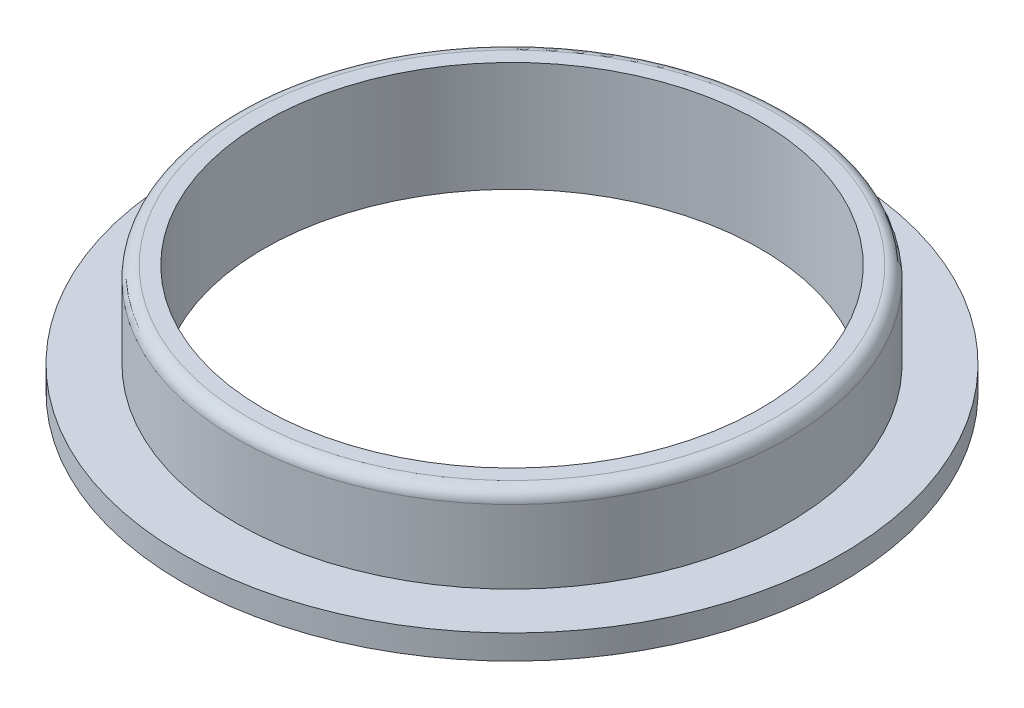
ISO-10303-21;
HEADER;
FILE_DESCRIPTION(('STEP AP214'),'2;1');
FILE_NAME('part.step','',(''),(''),'','','');
FILE_SCHEMA(('AUTOMOTIVE_DESIGN { 1 0 10303 214 1 1 1 1 }'));
ENDSEC;
DATA;
#1=APPLICATION_CONTEXT('core data for automotive mechanical design processes');
#2=APPLICATION_PROTOCOL_DEFINITION('international standard','automotive_design',2000,#1);
#3=PRODUCT_CONTEXT('',#1,'mechanical');
#4=PRODUCT('Part','Part','',(#3));
#5=PRODUCT_RELATED_PRODUCT_CATEGORY('part','',(#4));
#6=PRODUCT_DEFINITION_FORMATION('','',#4);
#7=PRODUCT_DEFINITION_CONTEXT('part definition',#1,'design');
#8=PRODUCT_DEFINITION('design','',#6,#7);
#9=PRODUCT_DEFINITION_SHAPE('','',#8);
#10=(LENGTH_UNIT() NAMED_UNIT(*) SI_UNIT(.MILLI.,.METRE.));
#11=(NAMED_UNIT(*) PLANE_ANGLE_UNIT() SI_UNIT($,.RADIAN.));
#12=(NAMED_UNIT(*) SI_UNIT($,.STERADIAN.) SOLID_ANGLE_UNIT());
#13=UNCERTAINTY_MEASURE_WITH_UNIT(LENGTH_MEASURE(1.E-05),#10,'distance_accuracy_value','');
#14=(GEOMETRIC_REPRESENTATION_CONTEXT(3) GLOBAL_UNCERTAINTY_ASSIGNED_CONTEXT((#13)) GLOBAL_UNIT_ASSIGNED_CONTEXT((#10,
#11,#12)) REPRESENTATION_CONTEXT('',''));
#15=CARTESIAN_POINT('',(0.,0.,0.));
#16=DIRECTION('',(0.,0.,1.));
#17=DIRECTION('',(1.,0.,0.));
#18=AXIS2_PLACEMENT_3D('',#15,#16,#17);
#19=CARTESIAN_POINT('',(0.,9.,0.));
#20=DIRECTION('',(0.,-1.,0.));
#21=DIRECTION('',(0.,0.,-1.));
#22=AXIS2_PLACEMENT_3D('',#19,#20,#21);
#23=CYLINDRICAL_SURFACE('',#22,27.);
#24=CARTESIAN_POINT('',(0.,0.,0.));
#25=DIRECTION('',(0.,1.,0.));
#26=DIRECTION('',(0.,0.,1.));
#27=AXIS2_PLACEMENT_3D('',#24,#25,#26);
#28=CIRCLE('',#27,27.);
#29=CARTESIAN_POINT('',(0.,0.,27.));
#30=VERTEX_POINT('',#29);
#31=EDGE_CURVE('E28',#30,#30,#28,.T.);
#32=ORIENTED_EDGE('',*,*,#31,.T.);
#33=EDGE_LOOP('',(#32));
#34=FACE_BOUND('',#33,.T.);
#35=CARTESIAN_POINT('',(0.,2.,0.));
#36=DIRECTION('',(0.,1.,0.));
#37=DIRECTION('',(0.,0.,1.));
#38=AXIS2_PLACEMENT_3D('',#35,#36,#37);
#39=CIRCLE('',#38,27.);
#40=CARTESIAN_POINT('',(0.,2.,27.));
#41=VERTEX_POINT('',#40);
#42=EDGE_CURVE('E33',#41,#41,#39,.T.);
#43=ORIENTED_EDGE('',*,*,#42,.F.);
#44=EDGE_LOOP('',(#43));
#45=FACE_BOUND('',#44,.T.);
#46=ADVANCED_FACE('F14',(#34,#45),#23,.T.);
#47=CARTESIAN_POINT('',(0.,0.,0.));
#48=DIRECTION('',(0.,1.,0.));
#49=DIRECTION('',(0.,0.,1.));
#50=AXIS2_PLACEMENT_3D('',#47,#48,#49);
#51=PLANE('',#50);
#52=CARTESIAN_POINT('',(0.,0.,0.));
#53=DIRECTION('',(0.,1.,0.));
#54=DIRECTION('',(0.,0.,1.));
#55=AXIS2_PLACEMENT_3D('',#52,#53,#54);
#56=CIRCLE('',#55,20.35);
#57=CARTESIAN_POINT('',(0.,0.,20.35));
#58=VERTEX_POINT('',#57);
#59=EDGE_CURVE('E43',#58,#58,#56,.T.);
#60=ORIENTED_EDGE('',*,*,#59,.T.);
#61=EDGE_LOOP('',(#60));
#62=FACE_BOUND('',#61,.T.);
#63=ORIENTED_EDGE('',*,*,#31,.F.);
#64=EDGE_LOOP('',(#63));
#65=FACE_BOUND('',#64,.T.);
#66=ADVANCED_FACE('F52',(#62,#65),#51,.F.);
#67=CARTESIAN_POINT('',(0.,2.,0.));
#68=DIRECTION('',(0.,1.,0.));
#69=DIRECTION('',(0.,0.,1.));
#70=AXIS2_PLACEMENT_3D('',#67,#68,#69);
#71=PLANE('',#70);
#72=CARTESIAN_POINT('',(0.,2.,0.));
#73=DIRECTION('',(0.,1.,0.));
#74=DIRECTION('',(0.,0.,1.));
#75=AXIS2_PLACEMENT_3D('',#72,#73,#74);
#76=CIRCLE('',#75,22.6);
#77=CARTESIAN_POINT('',(0.,2.,22.6));
#78=VERTEX_POINT('',#77);
#79=EDGE_CURVE('E38',#78,#78,#76,.T.);
#80=ORIENTED_EDGE('',*,*,#79,.F.);
#81=EDGE_LOOP('',(#80));
#82=FACE_BOUND('',#81,.T.);
#83=ORIENTED_EDGE('',*,*,#42,.T.);
#84=EDGE_LOOP('',(#83));
#85=FACE_BOUND('',#84,.T.);
#86=ADVANCED_FACE('F70',(#82,#85),#71,.T.);
#87=CARTESIAN_POINT('',(0.,2.,0.));
#88=DIRECTION('',(0.,1.,0.));
#89=DIRECTION('',(0.,0.,1.));
#90=AXIS2_PLACEMENT_3D('',#87,#88,#89);
#91=CYLINDRICAL_SURFACE('',#90,22.6);
#92=CARTESIAN_POINT('',(0.,8.,0.));
#93=DIRECTION('',(0.,1.,0.));
#94=DIRECTION('',(0.,0.,1.));
#95=AXIS2_PLACEMENT_3D('',#92,#93,#94);
#96=CIRCLE('',#95,22.6);
#97=CARTESIAN_POINT('',(0.,8.,22.6));
#98=VERTEX_POINT('',#97);
#99=EDGE_CURVE('E9',#98,#98,#96,.F.);
#100=ORIENTED_EDGE('',*,*,#99,.T.);
#101=EDGE_LOOP('',(#100));
#102=FACE_BOUND('',#101,.T.);
#103=ORIENTED_EDGE('',*,*,#79,.T.);
#104=EDGE_LOOP('',(#103));
#105=FACE_BOUND('',#104,.T.);
#106=ADVANCED_FACE('F63',(#102,#105),#91,.T.);
#107=CARTESIAN_POINT('',(0.,9.,0.));
#108=DIRECTION('',(0.,1.,0.));
#109=DIRECTION('',(0.,0.,1.));
#110=AXIS2_PLACEMENT_3D('',#107,#108,#109);
#111=PLANE('',#110);
#112=CARTESIAN_POINT('',(0.,9.,0.));
#113=DIRECTION('',(0.,1.,0.));
#114=DIRECTION('',(0.,0.,1.));
#115=AXIS2_PLACEMENT_3D('',#112,#113,#114);
#116=CIRCLE('',#115,21.6);
#117=CARTESIAN_POINT('',(0.,9.,21.6));
#118=VERTEX_POINT('',#117);
#119=EDGE_CURVE('E22',#118,#118,#116,.T.);
#120=ORIENTED_EDGE('',*,*,#119,.T.);
#121=EDGE_LOOP('',(#120));
#122=FACE_BOUND('',#121,.T.);
#123=CARTESIAN_POINT('',(0.,9.,0.));
#124=DIRECTION('',(0.,1.,0.));
#125=DIRECTION('',(0.,0.,1.));
#126=AXIS2_PLACEMENT_3D('',#123,#124,#125);
#127=CIRCLE('',#126,20.35);
#128=CARTESIAN_POINT('',(0.,9.,20.35));
#129=VERTEX_POINT('',#128);
#130=EDGE_CURVE('E44',#129,#129,#127,.T.);
#131=ORIENTED_EDGE('',*,*,#130,.F.);
#132=EDGE_LOOP('',(#131));
#133=FACE_BOUND('',#132,.T.);
#134=ADVANCED_FACE('F58',(#122,#133),#111,.T.);
#135=CARTESIAN_POINT('',(0.,0.,0.));
#136=DIRECTION('',(0.,1.,0.));
#137=DIRECTION('',(0.,0.,1.));
#138=AXIS2_PLACEMENT_3D('',#135,#136,#137);
#139=CYLINDRICAL_SURFACE('',#138,20.35);
#140=ORIENTED_EDGE('',*,*,#59,.F.);
#141=EDGE_LOOP('',(#140));
#142=FACE_BOUND('',#141,.T.);
#143=ORIENTED_EDGE('',*,*,#130,.T.);
#144=EDGE_LOOP('',(#143));
#145=FACE_BOUND('',#144,.T.);
#146=ADVANCED_FACE('F55',(#142,#145),#139,.F.);
#147=CARTESIAN_POINT('',(0.,8.,0.));
#148=DIRECTION('',(0.,1.,0.));
#149=DIRECTION('',(0.,0.,1.));
#150=AXIS2_PLACEMENT_3D('',#147,#148,#149);
#151=TOROIDAL_SURFACE('',#150,21.6,1.);
#152=ORIENTED_EDGE('',*,*,#99,.F.);
#153=EDGE_LOOP('',(#152));
#154=FACE_BOUND('',#153,.T.);
#155=ORIENTED_EDGE('',*,*,#119,.F.);
#156=EDGE_LOOP('',(#155));
#157=FACE_BOUND('',#156,.T.);
#158=ADVANCED_FACE('F16',(#154,#157),#151,.T.);
#159=CLOSED_SHELL('',(#46,#66,#86,#106,#134,#146,#158));
#160=MANIFOLD_SOLID_BREP('B1',#159);
#161=ADVANCED_BREP_SHAPE_REPRESENTATION('',(#18,#160),#14);
#162=SHAPE_DEFINITION_REPRESENTATION(#9,#161);
ENDSEC;
END-ISO-10303-21;
